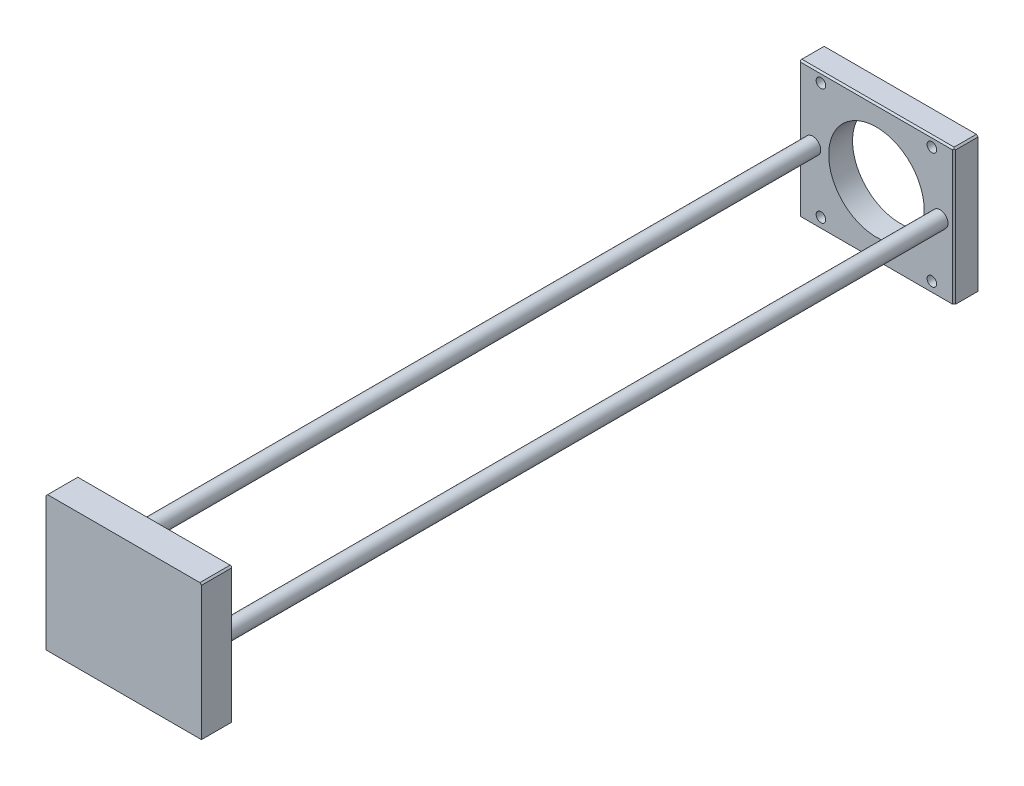
ISO-10303-21;
HEADER;
FILE_DESCRIPTION(('STEP AP214'),'2;1');
FILE_NAME('part.step','',(''),(''),'','','');
FILE_SCHEMA(('AUTOMOTIVE_DESIGN { 1 0 10303 214 1 1 1 1 }'));
ENDSEC;
DATA;
#1=APPLICATION_CONTEXT('core data for automotive mechanical design processes');
#2=APPLICATION_PROTOCOL_DEFINITION('international standard','automotive_design',2000,#1);
#3=PRODUCT_CONTEXT('',#1,'mechanical');
#4=PRODUCT('Part','Part','',(#3));
#5=PRODUCT_RELATED_PRODUCT_CATEGORY('part','',(#4));
#6=PRODUCT_DEFINITION_FORMATION('','',#4);
#7=PRODUCT_DEFINITION_CONTEXT('part definition',#1,'design');
#8=PRODUCT_DEFINITION('design','',#6,#7);
#9=PRODUCT_DEFINITION_SHAPE('','',#8);
#10=(LENGTH_UNIT() NAMED_UNIT(*) SI_UNIT(.MILLI.,.METRE.));
#11=(NAMED_UNIT(*) PLANE_ANGLE_UNIT() SI_UNIT($,.RADIAN.));
#12=(NAMED_UNIT(*) SI_UNIT($,.STERADIAN.) SOLID_ANGLE_UNIT());
#13=UNCERTAINTY_MEASURE_WITH_UNIT(LENGTH_MEASURE(1.E-05),#10,'distance_accuracy_value','');
#14=(GEOMETRIC_REPRESENTATION_CONTEXT(3) GLOBAL_UNCERTAINTY_ASSIGNED_CONTEXT((#13)) GLOBAL_UNIT_ASSIGNED_CONTEXT((#10,
#11,#12)) REPRESENTATION_CONTEXT('',''));
#15=CARTESIAN_POINT('',(0.,0.,0.));
#16=DIRECTION('',(0.,0.,1.));
#17=DIRECTION('',(1.,0.,0.));
#18=AXIS2_PLACEMENT_3D('',#15,#16,#17);
#19=CARTESIAN_POINT('',(0.,0.,15.));
#20=DIRECTION('',(0.,0.,1.));
#21=DIRECTION('',(1.,0.,0.));
#22=AXIS2_PLACEMENT_3D('',#19,#20,#21);
#23=PLANE('',#22);
#24=CARTESIAN_POINT('',(40.,0.,15.));
#25=DIRECTION('',(0.,0.,1.));
#26=DIRECTION('',(-1.,0.,0.));
#27=AXIS2_PLACEMENT_3D('',#24,#25,#26);
#28=CIRCLE('',#27,5.);
#29=CARTESIAN_POINT('',(35.,0.,15.));
#30=VERTEX_POINT('',#29);
#31=EDGE_CURVE('E217',#30,#30,#28,.T.);
#32=ORIENTED_EDGE('',*,*,#31,.F.);
#33=EDGE_LOOP('',(#32));
#34=FACE_BOUND('',#33,.T.);
#35=CARTESIAN_POINT('',(-40.,0.,15.));
#36=DIRECTION('',(0.,0.,1.));
#37=DIRECTION('',(1.,0.,0.));
#38=AXIS2_PLACEMENT_3D('',#35,#36,#37);
#39=CIRCLE('',#38,5.);
#40=CARTESIAN_POINT('',(-45.,0.,15.));
#41=VERTEX_POINT('',#40);
#42=EDGE_CURVE('E221',#41,#41,#39,.T.);
#43=ORIENTED_EDGE('',*,*,#42,.F.);
#44=EDGE_LOOP('',(#43));
#45=FACE_BOUND('',#44,.T.);
#46=CARTESIAN_POINT('',(34.85,-36.5,15.));
#47=DIRECTION('',(0.,0.,1.));
#48=DIRECTION('',(1.,0.,0.));
#49=AXIS2_PLACEMENT_3D('',#46,#47,#48);
#50=CIRCLE('',#49,3.);
#51=CARTESIAN_POINT('',(37.85,-36.5,15.));
#52=VERTEX_POINT('',#51);
#53=EDGE_CURVE('E241',#52,#52,#50,.T.);
#54=ORIENTED_EDGE('',*,*,#53,.F.);
#55=EDGE_LOOP('',(#54));
#56=FACE_BOUND('',#55,.T.);
#57=CARTESIAN_POINT('',(0.,0.,15.));
#58=DIRECTION('',(0.,0.,1.));
#59=DIRECTION('',(1.,0.,0.));
#60=AXIS2_PLACEMENT_3D('',#57,#58,#59);
#61=CIRCLE('',#60,30.);
#62=CARTESIAN_POINT('',(30.,0.,15.));
#63=VERTEX_POINT('',#62);
#64=EDGE_CURVE('E257',#63,#63,#61,.T.);
#65=ORIENTED_EDGE('',*,*,#64,.F.);
#66=EDGE_LOOP('',(#65));
#67=FACE_BOUND('',#66,.T.);
#68=DIRECTION('',(-1.,0.,0.));
#69=VECTOR('',#68,1.);
#70=CARTESIAN_POINT('',(-48.85,41.5,15.));
#71=LINE('',#70,#69);
#72=CARTESIAN_POINT('',(47.8500000000001,41.5000000000001,15.));
#73=VERTEX_POINT('',#72);
#74=CARTESIAN_POINT('',(-47.85,41.5,15.));
#75=VERTEX_POINT('',#74);
#76=EDGE_CURVE('E301',#73,#75,#71,.T.);
#77=ORIENTED_EDGE('',*,*,#76,.T.);
#78=DIRECTION('',(0.,-1.,0.));
#79=VECTOR('',#78,1.);
#80=CARTESIAN_POINT('',(-47.85,-42.5,15.));
#81=LINE('',#80,#79);
#82=CARTESIAN_POINT('',(-47.85,-42.5,15.));
#83=VERTEX_POINT('',#82);
#84=EDGE_CURVE('E304',#75,#83,#81,.T.);
#85=ORIENTED_EDGE('',*,*,#84,.T.);
#86=DIRECTION('',(1.,0.,0.));
#87=VECTOR('',#86,1.);
#88=CARTESIAN_POINT('',(48.85,-42.5,15.));
#89=LINE('',#88,#87);
#90=CARTESIAN_POINT('',(47.8500000000001,-42.5,15.));
#91=VERTEX_POINT('',#90);
#92=EDGE_CURVE('E273',#83,#91,#89,.T.);
#93=ORIENTED_EDGE('',*,*,#92,.T.);
#94=DIRECTION('',(0.,1.,0.));
#95=VECTOR('',#94,1.);
#96=CARTESIAN_POINT('',(47.8500000000001,42.5,15.));
#97=LINE('',#96,#95);
#98=EDGE_CURVE('E298',#91,#73,#97,.T.);
#99=ORIENTED_EDGE('',*,*,#98,.T.);
#100=EDGE_LOOP('',(#77,#85,#93,#99));
#101=FACE_BOUND('',#100,.T.);
#102=CARTESIAN_POINT('',(-34.85,36.5,15.));
#103=DIRECTION('',(0.,0.,1.));
#104=DIRECTION('',(1.,0.,0.));
#105=AXIS2_PLACEMENT_3D('',#102,#103,#104);
#106=CIRCLE('',#105,3.);
#107=CARTESIAN_POINT('',(-31.85,36.5,15.));
#108=VERTEX_POINT('',#107);
#109=EDGE_CURVE('E265',#108,#108,#106,.T.);
#110=ORIENTED_EDGE('',*,*,#109,.F.);
#111=EDGE_LOOP('',(#110));
#112=FACE_BOUND('',#111,.T.);
#113=CARTESIAN_POINT('',(34.8500000000001,36.5,15.));
#114=DIRECTION('',(0.,0.,1.));
#115=DIRECTION('',(-1.,0.,0.));
#116=AXIS2_PLACEMENT_3D('',#113,#114,#115);
#117=CIRCLE('',#116,3.);
#118=CARTESIAN_POINT('',(31.8500000000001,36.5,15.));
#119=VERTEX_POINT('',#118);
#120=EDGE_CURVE('E249',#119,#119,#117,.T.);
#121=ORIENTED_EDGE('',*,*,#120,.F.);
#122=EDGE_LOOP('',(#121));
#123=FACE_BOUND('',#122,.T.);
#124=CARTESIAN_POINT('',(-34.85,-36.5,15.));
#125=DIRECTION('',(0.,0.,1.));
#126=DIRECTION('',(-1.,0.,0.));
#127=AXIS2_PLACEMENT_3D('',#124,#125,#126);
#128=CIRCLE('',#127,3.);
#129=CARTESIAN_POINT('',(-37.85,-36.5,15.));
#130=VERTEX_POINT('',#129);
#131=EDGE_CURVE('E233',#130,#130,#128,.T.);
#132=ORIENTED_EDGE('',*,*,#131,.F.);
#133=EDGE_LOOP('',(#132));
#134=FACE_BOUND('',#133,.T.);
#135=ADVANCED_FACE('F47',(#34,#45,#56,#67,#101,#112,#123,#134),#23,.T.);
#136=CARTESIAN_POINT('',(0.,0.,0.));
#137=DIRECTION('',(0.,0.,1.));
#138=DIRECTION('',(1.,0.,0.));
#139=AXIS2_PLACEMENT_3D('',#136,#137,#138);
#140=PLANE('',#139);
#141=DIRECTION('',(0.,-1.,0.));
#142=VECTOR('',#141,1.);
#143=CARTESIAN_POINT('',(-48.85,-42.5,0.));
#144=LINE('',#143,#142);
#145=CARTESIAN_POINT('',(-48.85,41.5,0.));
#146=VERTEX_POINT('',#145);
#147=CARTESIAN_POINT('',(-48.85,-42.5,0.));
#148=VERTEX_POINT('',#147);
#149=EDGE_CURVE('E269',#146,#148,#144,.T.);
#150=ORIENTED_EDGE('',*,*,#149,.F.);
#151=DIRECTION('',(-0.707106781186548,-0.707106781186548,0.));
#152=VECTOR('',#151,1.);
#153=CARTESIAN_POINT('',(-48.85,41.5,0.));
#154=LINE('',#153,#152);
#155=CARTESIAN_POINT('',(-47.85,42.5,0.));
#156=VERTEX_POINT('',#155);
#157=EDGE_CURVE('E371',#146,#156,#154,.F.);
#158=ORIENTED_EDGE('',*,*,#157,.T.);
#159=DIRECTION('',(-1.,0.,0.));
#160=VECTOR('',#159,1.);
#161=CARTESIAN_POINT('',(48.85,42.5,0.));
#162=LINE('',#161,#160);
#163=CARTESIAN_POINT('',(47.8500000000001,42.5,0.));
#164=VERTEX_POINT('',#163);
#165=EDGE_CURVE('E278',#164,#156,#162,.T.);
#166=ORIENTED_EDGE('',*,*,#165,.F.);
#167=DIRECTION('',(-0.707106781186548,0.707106781186548,0.));
#168=VECTOR('',#167,1.);
#169=CARTESIAN_POINT('',(47.8500000000001,42.5,0.));
#170=LINE('',#169,#168);
#171=CARTESIAN_POINT('',(48.85,41.5000000000001,0.));
#172=VERTEX_POINT('',#171);
#173=EDGE_CURVE('E368',#164,#172,#170,.F.);
#174=ORIENTED_EDGE('',*,*,#173,.T.);
#175=DIRECTION('',(0.,1.,0.));
#176=VECTOR('',#175,1.);
#177=CARTESIAN_POINT('',(48.85,-42.5,0.));
#178=LINE('',#177,#176);
#179=CARTESIAN_POINT('',(48.85,-42.5,0.));
#180=VERTEX_POINT('',#179);
#181=EDGE_CURVE('E285',#180,#172,#178,.T.);
#182=ORIENTED_EDGE('',*,*,#181,.F.);
#183=DIRECTION('',(1.,0.,0.));
#184=VECTOR('',#183,1.);
#185=CARTESIAN_POINT('',(48.85,-42.5,0.));
#186=LINE('',#185,#184);
#187=EDGE_CURVE('E281',#148,#180,#186,.T.);
#188=ORIENTED_EDGE('',*,*,#187,.F.);
#189=EDGE_LOOP('',(#150,#158,#166,#174,#182,#188));
#190=FACE_BOUND('',#189,.T.);
#191=CARTESIAN_POINT('',(-34.85,36.5,0.));
#192=DIRECTION('',(0.,0.,1.));
#193=DIRECTION('',(1.,0.,0.));
#194=AXIS2_PLACEMENT_3D('',#191,#192,#193);
#195=CIRCLE('',#194,3.);
#196=CARTESIAN_POINT('',(-31.85,36.5,0.));
#197=VERTEX_POINT('',#196);
#198=EDGE_CURVE('E261',#197,#197,#195,.T.);
#199=ORIENTED_EDGE('',*,*,#198,.T.);
#200=EDGE_LOOP('',(#199));
#201=FACE_BOUND('',#200,.T.);
#202=CARTESIAN_POINT('',(0.,0.,0.));
#203=DIRECTION('',(0.,0.,1.));
#204=DIRECTION('',(1.,0.,0.));
#205=AXIS2_PLACEMENT_3D('',#202,#203,#204);
#206=CIRCLE('',#205,30.);
#207=CARTESIAN_POINT('',(30.,0.,0.));
#208=VERTEX_POINT('',#207);
#209=EDGE_CURVE('E253',#208,#208,#206,.T.);
#210=ORIENTED_EDGE('',*,*,#209,.T.);
#211=EDGE_LOOP('',(#210));
#212=FACE_BOUND('',#211,.T.);
#213=CARTESIAN_POINT('',(34.8500000000001,36.5,0.));
#214=DIRECTION('',(0.,0.,1.));
#215=DIRECTION('',(-1.,0.,0.));
#216=AXIS2_PLACEMENT_3D('',#213,#214,#215);
#217=CIRCLE('',#216,3.);
#218=CARTESIAN_POINT('',(31.8500000000001,36.5,0.));
#219=VERTEX_POINT('',#218);
#220=EDGE_CURVE('E245',#219,#219,#217,.T.);
#221=ORIENTED_EDGE('',*,*,#220,.T.);
#222=EDGE_LOOP('',(#221));
#223=FACE_BOUND('',#222,.T.);
#224=CARTESIAN_POINT('',(34.85,-36.5,0.));
#225=DIRECTION('',(0.,0.,1.));
#226=DIRECTION('',(1.,0.,0.));
#227=AXIS2_PLACEMENT_3D('',#224,#225,#226);
#228=CIRCLE('',#227,3.);
#229=CARTESIAN_POINT('',(37.85,-36.5,0.));
#230=VERTEX_POINT('',#229);
#231=EDGE_CURVE('E237',#230,#230,#228,.T.);
#232=ORIENTED_EDGE('',*,*,#231,.T.);
#233=EDGE_LOOP('',(#232));
#234=FACE_BOUND('',#233,.T.);
#235=CARTESIAN_POINT('',(-34.85,-36.5,0.));
#236=DIRECTION('',(0.,0.,1.));
#237=DIRECTION('',(-1.,0.,0.));
#238=AXIS2_PLACEMENT_3D('',#235,#236,#237);
#239=CIRCLE('',#238,3.);
#240=CARTESIAN_POINT('',(-37.85,-36.5,0.));
#241=VERTEX_POINT('',#240);
#242=EDGE_CURVE('E229',#241,#241,#239,.T.);
#243=ORIENTED_EDGE('',*,*,#242,.T.);
#244=EDGE_LOOP('',(#243));
#245=FACE_BOUND('',#244,.T.);
#246=ADVANCED_FACE('F454',(#190,#201,#212,#223,#234,#245),#140,.F.);
#247=CARTESIAN_POINT('',(-48.85,-42.5,15.));
#248=DIRECTION('',(1.,0.,0.));
#249=DIRECTION('',(0.,0.,-1.));
#250=AXIS2_PLACEMENT_3D('',#247,#248,#249);
#251=PLANE('',#250);
#252=DIRECTION('',(0.,1.,0.));
#253=VECTOR('',#252,1.);
#254=CARTESIAN_POINT('',(-48.85,42.5,14.0000000000001));
#255=LINE('',#254,#253);
#256=CARTESIAN_POINT('',(-48.85,-42.5,14.0000000000001));
#257=VERTEX_POINT('',#256);
#258=CARTESIAN_POINT('',(-48.85,41.5,14.0000000000001));
#259=VERTEX_POINT('',#258);
#260=EDGE_CURVE('E314',#257,#259,#255,.T.);
#261=ORIENTED_EDGE('',*,*,#260,.T.);
#262=DIRECTION('',(0.,0.,-1.));
#263=VECTOR('',#262,1.);
#264=CARTESIAN_POINT('',(-48.85,41.5,15.));
#265=LINE('',#264,#263);
#266=EDGE_CURVE('E351',#259,#146,#265,.T.);
#267=ORIENTED_EDGE('',*,*,#266,.T.);
#268=ORIENTED_EDGE('',*,*,#149,.T.);
#269=DIRECTION('',(0.,0.,-1.));
#270=VECTOR('',#269,1.);
#271=CARTESIAN_POINT('',(-48.85,-42.5,15.));
#272=LINE('',#271,#270);
#273=EDGE_CURVE('E294',#257,#148,#272,.T.);
#274=ORIENTED_EDGE('',*,*,#273,.F.);
#275=EDGE_LOOP('',(#261,#267,#268,#274));
#276=FACE_BOUND('',#275,.T.);
#277=ADVANCED_FACE('F460',(#276),#251,.F.);
#278=CARTESIAN_POINT('',(48.85,-42.5,15.));
#279=DIRECTION('',(0.,1.,0.));
#280=DIRECTION('',(-1.,0.,0.));
#281=AXIS2_PLACEMENT_3D('',#278,#279,#280);
#282=PLANE('',#281);
#283=ORIENTED_EDGE('',*,*,#92,.F.);
#284=DIRECTION('',(-0.707106781186547,0.,-0.707106781186547));
#285=VECTOR('',#284,1.);
#286=CARTESIAN_POINT('',(-47.85,-42.5,15.));
#287=LINE('',#286,#285);
#288=EDGE_CURVE('E311',#83,#257,#287,.T.);
#289=ORIENTED_EDGE('',*,*,#288,.T.);
#290=ORIENTED_EDGE('',*,*,#273,.T.);
#291=ORIENTED_EDGE('',*,*,#187,.T.);
#292=DIRECTION('',(0.,0.,-1.));
#293=VECTOR('',#292,1.);
#294=CARTESIAN_POINT('',(48.85,-42.5,15.));
#295=LINE('',#294,#293);
#296=CARTESIAN_POINT('',(48.85,-42.5,14.0000000000001));
#297=VERTEX_POINT('',#296);
#298=EDGE_CURVE('E277',#297,#180,#295,.T.);
#299=ORIENTED_EDGE('',*,*,#298,.F.);
#300=DIRECTION('',(-0.707106781186547,0.,0.707106781186547));
#301=VECTOR('',#300,1.);
#302=CARTESIAN_POINT('',(47.8500000000001,-42.5,15.));
#303=LINE('',#302,#301);
#304=EDGE_CURVE('E308',#297,#91,#303,.T.);
#305=ORIENTED_EDGE('',*,*,#304,.T.);
#306=EDGE_LOOP('',(#283,#289,#290,#291,#299,#305));
#307=FACE_BOUND('',#306,.T.);
#308=ADVANCED_FACE('F476',(#307),#282,.F.);
#309=CARTESIAN_POINT('',(48.85,-42.5,15.));
#310=DIRECTION('',(-1.,0.,0.));
#311=DIRECTION('',(0.,0.,1.));
#312=AXIS2_PLACEMENT_3D('',#309,#310,#311);
#313=PLANE('',#312);
#314=ORIENTED_EDGE('',*,*,#181,.T.);
#315=DIRECTION('',(0.,0.,1.));
#316=VECTOR('',#315,1.);
#317=CARTESIAN_POINT('',(48.85,41.5000000000001,15.));
#318=LINE('',#317,#316);
#319=CARTESIAN_POINT('',(48.85,41.5000000000001,14.0000000000001));
#320=VERTEX_POINT('',#319);
#321=EDGE_CURVE('E390',#172,#320,#318,.T.);
#322=ORIENTED_EDGE('',*,*,#321,.T.);
#323=DIRECTION('',(0.,-1.,0.));
#324=VECTOR('',#323,1.);
#325=CARTESIAN_POINT('',(48.85,-42.5,14.0000000000001));
#326=LINE('',#325,#324);
#327=EDGE_CURVE('E322',#320,#297,#326,.T.);
#328=ORIENTED_EDGE('',*,*,#327,.T.);
#329=ORIENTED_EDGE('',*,*,#298,.T.);
#330=EDGE_LOOP('',(#314,#322,#328,#329));
#331=FACE_BOUND('',#330,.T.);
#332=ADVANCED_FACE('F472',(#331),#313,.F.);
#333=CARTESIAN_POINT('',(48.85,42.5,15.));
#334=DIRECTION('',(0.,-1.,0.));
#335=DIRECTION('',(1.,0.,0.));
#336=AXIS2_PLACEMENT_3D('',#333,#334,#335);
#337=PLANE('',#336);
#338=ORIENTED_EDGE('',*,*,#165,.T.);
#339=DIRECTION('',(0.,0.,1.));
#340=VECTOR('',#339,1.);
#341=CARTESIAN_POINT('',(-47.85,42.5,15.));
#342=LINE('',#341,#340);
#343=CARTESIAN_POINT('',(-47.85,42.5,14.0000000000001));
#344=VERTEX_POINT('',#343);
#345=EDGE_CURVE('E378',#156,#344,#342,.T.);
#346=ORIENTED_EDGE('',*,*,#345,.T.);
#347=DIRECTION('',(1.,0.,0.));
#348=VECTOR('',#347,1.);
#349=CARTESIAN_POINT('',(48.85,42.5,14.0000000000001));
#350=LINE('',#349,#348);
#351=CARTESIAN_POINT('',(47.8500000000001,42.5,14.0000000000001));
#352=VERTEX_POINT('',#351);
#353=EDGE_CURVE('E318',#344,#352,#350,.T.);
#354=ORIENTED_EDGE('',*,*,#353,.T.);
#355=DIRECTION('',(0.,0.,-1.));
#356=VECTOR('',#355,1.);
#357=CARTESIAN_POINT('',(47.8500000000001,42.5,15.));
#358=LINE('',#357,#356);
#359=EDGE_CURVE('E374',#352,#164,#358,.T.);
#360=ORIENTED_EDGE('',*,*,#359,.T.);
#361=EDGE_LOOP('',(#338,#346,#354,#360));
#362=FACE_BOUND('',#361,.T.);
#363=ADVANCED_FACE('F469',(#362),#337,.F.);
#364=CARTESIAN_POINT('',(-34.85,36.5,15.));
#365=DIRECTION('',(0.,0.,-1.));
#366=DIRECTION('',(-1.,0.,0.));
#367=AXIS2_PLACEMENT_3D('',#364,#365,#366);
#368=CYLINDRICAL_SURFACE('',#367,3.);
#369=ORIENTED_EDGE('',*,*,#109,.T.);
#370=EDGE_LOOP('',(#369));
#371=FACE_BOUND('',#370,.T.);
#372=ORIENTED_EDGE('',*,*,#198,.F.);
#373=EDGE_LOOP('',(#372));
#374=FACE_BOUND('',#373,.T.);
#375=ADVANCED_FACE('F466',(#371,#374),#368,.F.);
#376=CARTESIAN_POINT('',(0.,0.,15.));
#377=DIRECTION('',(0.,0.,-1.));
#378=DIRECTION('',(-1.,0.,0.));
#379=AXIS2_PLACEMENT_3D('',#376,#377,#378);
#380=CYLINDRICAL_SURFACE('',#379,30.);
#381=ORIENTED_EDGE('',*,*,#64,.T.);
#382=EDGE_LOOP('',(#381));
#383=FACE_BOUND('',#382,.T.);
#384=ORIENTED_EDGE('',*,*,#209,.F.);
#385=EDGE_LOOP('',(#384));
#386=FACE_BOUND('',#385,.T.);
#387=ADVANCED_FACE('F590',(#383,#386),#380,.F.);
#388=CARTESIAN_POINT('',(34.8500000000001,36.5,15.));
#389=DIRECTION('',(0.,0.,-1.));
#390=DIRECTION('',(-1.,0.,0.));
#391=AXIS2_PLACEMENT_3D('',#388,#389,#390);
#392=CYLINDRICAL_SURFACE('',#391,3.);
#393=ORIENTED_EDGE('',*,*,#120,.T.);
#394=EDGE_LOOP('',(#393));
#395=FACE_BOUND('',#394,.T.);
#396=ORIENTED_EDGE('',*,*,#220,.F.);
#397=EDGE_LOOP('',(#396));
#398=FACE_BOUND('',#397,.T.);
#399=ADVANCED_FACE('F584',(#395,#398),#392,.F.);
#400=CARTESIAN_POINT('',(34.85,-36.5,15.));
#401=DIRECTION('',(0.,0.,-1.));
#402=DIRECTION('',(-1.,0.,0.));
#403=AXIS2_PLACEMENT_3D('',#400,#401,#402);
#404=CYLINDRICAL_SURFACE('',#403,3.);
#405=ORIENTED_EDGE('',*,*,#53,.T.);
#406=EDGE_LOOP('',(#405));
#407=FACE_BOUND('',#406,.T.);
#408=ORIENTED_EDGE('',*,*,#231,.F.);
#409=EDGE_LOOP('',(#408));
#410=FACE_BOUND('',#409,.T.);
#411=ADVANCED_FACE('F574',(#407,#410),#404,.F.);
#412=CARTESIAN_POINT('',(-34.85,-36.5,15.));
#413=DIRECTION('',(0.,0.,-1.));
#414=DIRECTION('',(-1.,0.,0.));
#415=AXIS2_PLACEMENT_3D('',#412,#413,#414);
#416=CYLINDRICAL_SURFACE('',#415,3.);
#417=ORIENTED_EDGE('',*,*,#131,.T.);
#418=EDGE_LOOP('',(#417));
#419=FACE_BOUND('',#418,.T.);
#420=ORIENTED_EDGE('',*,*,#242,.F.);
#421=EDGE_LOOP('',(#420));
#422=FACE_BOUND('',#421,.T.);
#423=ADVANCED_FACE('F571',(#419,#422),#416,.F.);
#424=CARTESIAN_POINT('',(-40.,0.,468.));
#425=DIRECTION('',(0.,0.,-1.));
#426=DIRECTION('',(-1.,0.,0.));
#427=AXIS2_PLACEMENT_3D('',#424,#425,#426);
#428=CYLINDRICAL_SURFACE('',#427,5.);
#429=CARTESIAN_POINT('',(-40.,0.,468.));
#430=DIRECTION('',(0.,0.,1.));
#431=DIRECTION('',(1.,0.,0.));
#432=AXIS2_PLACEMENT_3D('',#429,#430,#431);
#433=CIRCLE('',#432,5.);
#434=CARTESIAN_POINT('',(-45.,0.,468.));
#435=VERTEX_POINT('',#434);
#436=EDGE_CURVE('E225',#435,#435,#433,.T.);
#437=CARTESIAN_POINT('',(-45.,0.,468.));
#438=CARTESIAN_POINT('',(-45.,0.,463.28125));
#439=CARTESIAN_POINT('',(-45.,0.,458.5625));
#440=CARTESIAN_POINT('',(-45.,0.,449.125));
#441=CARTESIAN_POINT('',(-45.,0.,444.40625));
#442=CARTESIAN_POINT('',(-45.,0.,434.96875));
#443=CARTESIAN_POINT('',(-45.,0.,430.25));
#444=CARTESIAN_POINT('',(-45.,0.,420.8125));
#445=CARTESIAN_POINT('',(-45.,0.,416.09375));
#446=CARTESIAN_POINT('',(-45.,0.,406.65625));
#447=CARTESIAN_POINT('',(-45.,0.,401.9375));
#448=CARTESIAN_POINT('',(-45.,0.,392.5));
#449=CARTESIAN_POINT('',(-45.,0.,387.78125));
#450=CARTESIAN_POINT('',(-45.,0.,378.34375));
#451=CARTESIAN_POINT('',(-45.,0.,373.625));
#452=CARTESIAN_POINT('',(-45.,0.,364.1875));
#453=CARTESIAN_POINT('',(-45.,0.,359.46875));
#454=CARTESIAN_POINT('',(-45.,0.,350.03125));
#455=CARTESIAN_POINT('',(-45.,0.,345.3125));
#456=CARTESIAN_POINT('',(-45.,0.,335.875));
#457=CARTESIAN_POINT('',(-45.,0.,331.15625));
#458=CARTESIAN_POINT('',(-45.,0.,321.71875));
#459=CARTESIAN_POINT('',(-45.,0.,317.));
#460=CARTESIAN_POINT('',(-45.,0.,307.5625));
#461=CARTESIAN_POINT('',(-45.,0.,302.84375));
#462=CARTESIAN_POINT('',(-45.,0.,293.40625));
#463=CARTESIAN_POINT('',(-45.,0.,288.6875));
#464=CARTESIAN_POINT('',(-45.,0.,279.25));
#465=CARTESIAN_POINT('',(-45.,0.,274.53125));
#466=CARTESIAN_POINT('',(-45.,0.,265.09375));
#467=CARTESIAN_POINT('',(-45.,0.,260.375));
#468=CARTESIAN_POINT('',(-45.,0.,250.9375));
#469=CARTESIAN_POINT('',(-45.,0.,246.21875));
#470=CARTESIAN_POINT('',(-45.,0.,236.78125));
#471=CARTESIAN_POINT('',(-45.,0.,232.0625));
#472=CARTESIAN_POINT('',(-45.,0.,222.625));
#473=CARTESIAN_POINT('',(-45.,0.,217.90625));
#474=CARTESIAN_POINT('',(-45.,0.,208.46875));
#475=CARTESIAN_POINT('',(-45.,0.,203.75));
#476=CARTESIAN_POINT('',(-45.,0.,194.3125));
#477=CARTESIAN_POINT('',(-45.,0.,189.59375));
#478=CARTESIAN_POINT('',(-45.,0.,180.15625));
#479=CARTESIAN_POINT('',(-45.,0.,175.4375));
#480=CARTESIAN_POINT('',(-45.,0.,166.));
#481=CARTESIAN_POINT('',(-45.,0.,161.28125));
#482=CARTESIAN_POINT('',(-45.,0.,151.84375));
#483=CARTESIAN_POINT('',(-45.,0.,147.125));
#484=CARTESIAN_POINT('',(-45.,0.,137.6875));
#485=CARTESIAN_POINT('',(-45.,0.,132.96875));
#486=CARTESIAN_POINT('',(-45.,0.,123.53125));
#487=CARTESIAN_POINT('',(-45.,0.,118.8125));
#488=CARTESIAN_POINT('',(-45.,0.,109.375));
#489=CARTESIAN_POINT('',(-45.,0.,104.65625));
#490=CARTESIAN_POINT('',(-45.,0.,95.21875));
#491=CARTESIAN_POINT('',(-45.,0.,90.5));
#492=CARTESIAN_POINT('',(-45.,0.,81.0625));
#493=CARTESIAN_POINT('',(-45.,0.,76.34375));
#494=CARTESIAN_POINT('',(-45.,0.,66.90625));
#495=CARTESIAN_POINT('',(-45.,0.,62.1875));
#496=CARTESIAN_POINT('',(-45.,0.,52.75));
#497=CARTESIAN_POINT('',(-45.,0.,48.03125));
#498=CARTESIAN_POINT('',(-45.,0.,38.59375));
#499=CARTESIAN_POINT('',(-45.,0.,33.875));
#500=CARTESIAN_POINT('',(-45.,0.,24.4375));
#501=CARTESIAN_POINT('',(-45.,0.,19.71875));
#502=CARTESIAN_POINT('',(-45.,0.,15.));
#503=B_SPLINE_CURVE_WITH_KNOTS('',3,(#437,#438,#439,#440,#441,#442,#443,#444,#445,#446,#447,
#448,#449,#450,#451,#452,#453,#454,#455,#456,#457,#458,#459,#460,#461,#462,#463,#464,#465,#466,
#467,#468,#469,#470,#471,#472,#473,#474,#475,#476,#477,#478,#479,#480,#481,#482,#483,#484,#485,
#486,#487,#488,#489,#490,#491,#492,#493,#494,#495,#496,#497,#498,#499,#500,#501,#502),
.UNSPECIFIED.,.F.,.F.,(4,2,2,2,2,2,2,2,2,2,2,2,2,2,2,2,2,2,2,2,2,2,2,2,2,2,2,2,2,2,2,2,4),(0.,
14.15625,28.3125,42.46875,56.625,70.78125,84.9375000000001,99.09375,113.25,127.40625,141.5625,
155.71875,169.875,184.03125,198.1875,212.34375,226.5,240.65625,254.8125,268.96875,283.125,
297.28125,311.4375,325.59375,339.75,353.90625,368.0625,382.21875,396.375,410.53125,424.6875,
438.84375,453.),.UNSPECIFIED.);
#504=EDGE_CURVE('BSEAM573',#435,#41,#503,.T.);
#505=ORIENTED_EDGE('',*,*,#436,.F.);
#506=ORIENTED_EDGE('',*,*,#42,.T.);
#507=ORIENTED_EDGE('',*,*,#504,.T.);
#508=ORIENTED_EDGE('',*,*,#504,.F.);
#509=EDGE_LOOP('',(#505,#507,#506,#508));
#510=FACE_BOUND('',#509,.T.);
#511=ADVANCED_FACE('F573',(#510),#428,.T.);
#512=CARTESIAN_POINT('',(40.,0.,468.));
#513=DIRECTION('',(0.,0.,-1.));
#514=DIRECTION('',(-1.,0.,0.));
#515=AXIS2_PLACEMENT_3D('',#512,#513,#514);
#516=CYLINDRICAL_SURFACE('',#515,5.);
#517=CARTESIAN_POINT('',(40.,0.,468.));
#518=DIRECTION('',(0.,0.,1.));
#519=DIRECTION('',(-1.,0.,0.));
#520=AXIS2_PLACEMENT_3D('',#517,#518,#519);
#521=CIRCLE('',#520,5.);
#522=CARTESIAN_POINT('',(35.,0.,468.));
#523=VERTEX_POINT('',#522);
#524=EDGE_CURVE('E215',#523,#523,#521,.T.);
#525=CARTESIAN_POINT('',(35.,0.,468.));
#526=CARTESIAN_POINT('',(35.,0.,463.28125));
#527=CARTESIAN_POINT('',(35.,0.,458.5625));
#528=CARTESIAN_POINT('',(35.,0.,449.125));
#529=CARTESIAN_POINT('',(35.,0.,444.40625));
#530=CARTESIAN_POINT('',(35.,0.,434.96875));
#531=CARTESIAN_POINT('',(35.,0.,430.25));
#532=CARTESIAN_POINT('',(35.,0.,420.8125));
#533=CARTESIAN_POINT('',(35.,0.,416.09375));
#534=CARTESIAN_POINT('',(35.,0.,406.65625));
#535=CARTESIAN_POINT('',(35.,0.,401.9375));
#536=CARTESIAN_POINT('',(35.,0.,392.5));
#537=CARTESIAN_POINT('',(35.,0.,387.78125));
#538=CARTESIAN_POINT('',(35.,0.,378.34375));
#539=CARTESIAN_POINT('',(35.,0.,373.625));
#540=CARTESIAN_POINT('',(35.,0.,364.1875));
#541=CARTESIAN_POINT('',(35.,0.,359.46875));
#542=CARTESIAN_POINT('',(35.,0.,350.03125));
#543=CARTESIAN_POINT('',(35.,0.,345.3125));
#544=CARTESIAN_POINT('',(35.,0.,335.875));
#545=CARTESIAN_POINT('',(35.,0.,331.15625));
#546=CARTESIAN_POINT('',(35.,0.,321.71875));
#547=CARTESIAN_POINT('',(35.,0.,317.));
#548=CARTESIAN_POINT('',(35.,0.,307.5625));
#549=CARTESIAN_POINT('',(35.,0.,302.84375));
#550=CARTESIAN_POINT('',(35.,0.,293.40625));
#551=CARTESIAN_POINT('',(35.,0.,288.6875));
#552=CARTESIAN_POINT('',(35.,0.,279.25));
#553=CARTESIAN_POINT('',(35.,0.,274.53125));
#554=CARTESIAN_POINT('',(35.,0.,265.09375));
#555=CARTESIAN_POINT('',(35.,0.,260.375));
#556=CARTESIAN_POINT('',(35.,0.,250.9375));
#557=CARTESIAN_POINT('',(35.,0.,246.21875));
#558=CARTESIAN_POINT('',(35.,0.,236.78125));
#559=CARTESIAN_POINT('',(35.,0.,232.0625));
#560=CARTESIAN_POINT('',(35.,0.,222.625));
#561=CARTESIAN_POINT('',(35.,0.,217.90625));
#562=CARTESIAN_POINT('',(35.,0.,208.46875));
#563=CARTESIAN_POINT('',(35.,0.,203.75));
#564=CARTESIAN_POINT('',(35.,0.,194.3125));
#565=CARTESIAN_POINT('',(35.,0.,189.59375));
#566=CARTESIAN_POINT('',(35.,0.,180.15625));
#567=CARTESIAN_POINT('',(35.,0.,175.4375));
#568=CARTESIAN_POINT('',(35.,0.,166.));
#569=CARTESIAN_POINT('',(35.,0.,161.28125));
#570=CARTESIAN_POINT('',(35.,0.,151.84375));
#571=CARTESIAN_POINT('',(35.,0.,147.125));
#572=CARTESIAN_POINT('',(35.,0.,137.6875));
#573=CARTESIAN_POINT('',(35.,0.,132.96875));
#574=CARTESIAN_POINT('',(35.,0.,123.53125));
#575=CARTESIAN_POINT('',(35.,0.,118.8125));
#576=CARTESIAN_POINT('',(35.,0.,109.375));
#577=CARTESIAN_POINT('',(35.,0.,104.65625));
#578=CARTESIAN_POINT('',(35.,0.,95.21875));
#579=CARTESIAN_POINT('',(35.,0.,90.5));
#580=CARTESIAN_POINT('',(35.,0.,81.0625));
#581=CARTESIAN_POINT('',(35.,0.,76.34375));
#582=CARTESIAN_POINT('',(35.,0.,66.90625));
#583=CARTESIAN_POINT('',(35.,0.,62.1875));
#584=CARTESIAN_POINT('',(35.,0.,52.75));
#585=CARTESIAN_POINT('',(35.,0.,48.03125));
#586=CARTESIAN_POINT('',(35.,0.,38.59375));
#587=CARTESIAN_POINT('',(35.,0.,33.875));
#588=CARTESIAN_POINT('',(35.,0.,24.4375));
#589=CARTESIAN_POINT('',(35.,0.,19.71875));
#590=CARTESIAN_POINT('',(35.,0.,15.));
#591=B_SPLINE_CURVE_WITH_KNOTS('',3,(#525,#526,#527,#528,#529,#530,#531,#532,#533,#534,#535,
#536,#537,#538,#539,#540,#541,#542,#543,#544,#545,#546,#547,#548,#549,#550,#551,#552,#553,#554,
#555,#556,#557,#558,#559,#560,#561,#562,#563,#564,#565,#566,#567,#568,#569,#570,#571,#572,#573,
#574,#575,#576,#577,#578,#579,#580,#581,#582,#583,#584,#585,#586,#587,#588,#589,#590),
.UNSPECIFIED.,.F.,.F.,(4,2,2,2,2,2,2,2,2,2,2,2,2,2,2,2,2,2,2,2,2,2,2,2,2,2,2,2,2,2,2,2,4),(0.,
14.15625,28.3125,42.46875,56.625,70.78125,84.9375000000001,99.09375,113.25,127.40625,141.5625,
155.71875,169.875,184.03125,198.1875,212.34375,226.5,240.65625,254.8125,268.96875,283.125,
297.28125,311.4375,325.59375,339.75,353.90625,368.0625,382.21875,396.375,410.53125,424.6875,
438.84375,453.),.UNSPECIFIED.);
#592=EDGE_CURVE('BSEAM581',#523,#30,#591,.T.);
#593=ORIENTED_EDGE('',*,*,#524,.F.);
#594=ORIENTED_EDGE('',*,*,#31,.T.);
#595=ORIENTED_EDGE('',*,*,#592,.T.);
#596=ORIENTED_EDGE('',*,*,#592,.F.);
#597=EDGE_LOOP('',(#593,#595,#594,#596));
#598=FACE_BOUND('',#597,.T.);
#599=ADVANCED_FACE('F581',(#598),#516,.T.);
#600=CARTESIAN_POINT('',(-40.,-42.5,488.));
#601=DIRECTION('',(0.,-1.,0.));
#602=DIRECTION('',(0.,0.,-1.));
#603=AXIS2_PLACEMENT_3D('',#600,#601,#602);
#604=PLANE('',#603);
#605=DIRECTION('',(0.,0.,-1.));
#606=VECTOR('',#605,1.);
#607=CARTESIAN_POINT('',(-48.85,-42.5,488.));
#608=LINE('',#607,#606);
#609=CARTESIAN_POINT('',(-48.85,-42.5,488.));
#610=VERTEX_POINT('',#609);
#611=CARTESIAN_POINT('',(-48.85,-42.5,469.));
#612=VERTEX_POINT('',#611);
#613=EDGE_CURVE('E173',#610,#612,#608,.T.);
#614=ORIENTED_EDGE('',*,*,#613,.T.);
#615=DIRECTION('',(-0.707106781186548,0.,0.707106781186548));
#616=VECTOR('',#615,1.);
#617=CARTESIAN_POINT('',(-53.925,-42.5,474.075));
#618=LINE('',#617,#616);
#619=CARTESIAN_POINT('',(-47.85,-42.5,468.));
#620=VERTEX_POINT('',#619);
#621=EDGE_CURVE('E341',#612,#620,#618,.F.);
#622=ORIENTED_EDGE('',*,*,#621,.T.);
#623=DIRECTION('',(-1.,0.,0.));
#624=VECTOR('',#623,1.);
#625=CARTESIAN_POINT('',(-40.,-42.5,468.));
#626=LINE('',#625,#624);
#627=CARTESIAN_POINT('',(47.8500000000001,-42.5,468.));
#628=VERTEX_POINT('',#627);
#629=EDGE_CURVE('E202',#628,#620,#626,.T.);
#630=ORIENTED_EDGE('',*,*,#629,.F.);
#631=DIRECTION('',(-0.707106781186548,0.,-0.707106781186548));
#632=VECTOR('',#631,1.);
#633=CARTESIAN_POINT('',(13.925,-42.5,434.075));
#634=LINE('',#633,#632);
#635=CARTESIAN_POINT('',(48.85,-42.5,469.));
#636=VERTEX_POINT('',#635);
#637=EDGE_CURVE('E338',#628,#636,#634,.F.);
#638=ORIENTED_EDGE('',*,*,#637,.T.);
#639=DIRECTION('',(0.,0.,-1.));
#640=VECTOR('',#639,1.);
#641=CARTESIAN_POINT('',(48.85,-42.5,488.));
#642=LINE('',#641,#640);
#643=CARTESIAN_POINT('',(48.85,-42.5,488.));
#644=VERTEX_POINT('',#643);
#645=EDGE_CURVE('E185',#644,#636,#642,.T.);
#646=ORIENTED_EDGE('',*,*,#645,.F.);
#647=DIRECTION('',(-1.,0.,0.));
#648=VECTOR('',#647,1.);
#649=CARTESIAN_POINT('',(-40.,-42.5,488.));
#650=LINE('',#649,#648);
#651=EDGE_CURVE('E192',#644,#610,#650,.T.);
#652=ORIENTED_EDGE('',*,*,#651,.T.);
#653=EDGE_LOOP('',(#614,#622,#630,#638,#646,#652));
#654=FACE_BOUND('',#653,.T.);
#655=ADVANCED_FACE('F199',(#654),#604,.T.);
#656=CARTESIAN_POINT('',(48.85,0.,488.));
#657=DIRECTION('',(1.,0.,0.));
#658=DIRECTION('',(0.,0.,-1.));
#659=AXIS2_PLACEMENT_3D('',#656,#657,#658);
#660=PLANE('',#659);
#661=DIRECTION('',(0.,1.,0.));
#662=VECTOR('',#661,1.);
#663=CARTESIAN_POINT('',(48.85,0.,469.));
#664=LINE('',#663,#662);
#665=CARTESIAN_POINT('',(48.85,41.5,469.));
#666=VERTEX_POINT('',#665);
#667=EDGE_CURVE('E348',#636,#666,#664,.T.);
#668=ORIENTED_EDGE('',*,*,#667,.T.);
#669=DIRECTION('',(0.,0.,1.));
#670=VECTOR('',#669,1.);
#671=CARTESIAN_POINT('',(48.85,41.5,488.));
#672=LINE('',#671,#670);
#673=CARTESIAN_POINT('',(48.85,41.5,488.));
#674=VERTEX_POINT('',#673);
#675=EDGE_CURVE('E11',#666,#674,#672,.T.);
#676=ORIENTED_EDGE('',*,*,#675,.T.);
#677=DIRECTION('',(0.,-1.,0.));
#678=VECTOR('',#677,1.);
#679=CARTESIAN_POINT('',(48.85,0.,488.));
#680=LINE('',#679,#678);
#681=EDGE_CURVE('E186',#674,#644,#680,.T.);
#682=ORIENTED_EDGE('',*,*,#681,.T.);
#683=ORIENTED_EDGE('',*,*,#645,.T.);
#684=EDGE_LOOP('',(#668,#676,#682,#683));
#685=FACE_BOUND('',#684,.T.);
#686=ADVANCED_FACE('F654',(#685),#660,.T.);
#687=CARTESIAN_POINT('',(-40.,42.5,488.));
#688=DIRECTION('',(0.,1.,0.));
#689=DIRECTION('',(0.,0.,1.));
#690=AXIS2_PLACEMENT_3D('',#687,#688,#689);
#691=PLANE('',#690);
#692=DIRECTION('',(-1.,0.,0.));
#693=VECTOR('',#692,1.);
#694=CARTESIAN_POINT('',(-40.,42.5,469.));
#695=LINE('',#694,#693);
#696=CARTESIAN_POINT('',(47.8500000000001,42.5,469.));
#697=VERTEX_POINT('',#696);
#698=CARTESIAN_POINT('',(-47.85,42.5,469.));
#699=VERTEX_POINT('',#698);
#700=EDGE_CURVE('E344',#697,#699,#695,.T.);
#701=ORIENTED_EDGE('',*,*,#700,.T.);
#702=DIRECTION('',(0.,0.,1.));
#703=VECTOR('',#702,1.);
#704=CARTESIAN_POINT('',(-47.85,42.5,488.));
#705=LINE('',#704,#703);
#706=CARTESIAN_POINT('',(-47.85,42.5,488.));
#707=VERTEX_POINT('',#706);
#708=EDGE_CURVE('E412',#699,#707,#705,.T.);
#709=ORIENTED_EDGE('',*,*,#708,.T.);
#710=DIRECTION('',(1.,0.,0.));
#711=VECTOR('',#710,1.);
#712=CARTESIAN_POINT('',(-40.,42.5,488.));
#713=LINE('',#712,#711);
#714=CARTESIAN_POINT('',(47.8500000000001,42.5,488.));
#715=VERTEX_POINT('',#714);
#716=EDGE_CURVE('E196',#707,#715,#713,.T.);
#717=ORIENTED_EDGE('',*,*,#716,.T.);
#718=DIRECTION('',(0.,0.,-1.));
#719=VECTOR('',#718,1.);
#720=CARTESIAN_POINT('',(47.8500000000001,42.5,488.));
#721=LINE('',#720,#719);
#722=EDGE_CURVE('E408',#715,#697,#721,.T.);
#723=ORIENTED_EDGE('',*,*,#722,.T.);
#724=EDGE_LOOP('',(#701,#709,#717,#723));
#725=FACE_BOUND('',#724,.T.);
#726=ADVANCED_FACE('F424',(#725),#691,.T.);
#727=CARTESIAN_POINT('',(-48.85,0.,488.));
#728=DIRECTION('',(-1.,0.,0.));
#729=DIRECTION('',(0.,0.,1.));
#730=AXIS2_PLACEMENT_3D('',#727,#728,#729);
#731=PLANE('',#730);
#732=DIRECTION('',(0.,1.,0.));
#733=VECTOR('',#732,1.);
#734=CARTESIAN_POINT('',(-48.85,0.,488.));
#735=LINE('',#734,#733);
#736=CARTESIAN_POINT('',(-48.85,41.5,488.));
#737=VERTEX_POINT('',#736);
#738=EDGE_CURVE('E177',#610,#737,#735,.T.);
#739=ORIENTED_EDGE('',*,*,#738,.T.);
#740=DIRECTION('',(0.,0.,-1.));
#741=VECTOR('',#740,1.);
#742=CARTESIAN_POINT('',(-48.85,41.5,488.));
#743=LINE('',#742,#741);
#744=CARTESIAN_POINT('',(-48.85,41.5,469.));
#745=VERTEX_POINT('',#744);
#746=EDGE_CURVE('E396',#737,#745,#743,.T.);
#747=ORIENTED_EDGE('',*,*,#746,.T.);
#748=DIRECTION('',(0.,-1.,0.));
#749=VECTOR('',#748,1.);
#750=CARTESIAN_POINT('',(-48.85,0.,469.));
#751=LINE('',#750,#749);
#752=EDGE_CURVE('E180',#745,#612,#751,.T.);
#753=ORIENTED_EDGE('',*,*,#752,.T.);
#754=ORIENTED_EDGE('',*,*,#613,.F.);
#755=EDGE_LOOP('',(#739,#747,#753,#754));
#756=FACE_BOUND('',#755,.T.);
#757=ADVANCED_FACE('F175',(#756),#731,.T.);
#758=CARTESIAN_POINT('',(0.,0.,488.));
#759=DIRECTION('',(0.,0.,-1.));
#760=DIRECTION('',(-1.,0.,0.));
#761=AXIS2_PLACEMENT_3D('',#758,#759,#760);
#762=PLANE('',#761);
#763=ORIENTED_EDGE('',*,*,#716,.F.);
#764=DIRECTION('',(0.707106781186548,0.707106781186548,0.));
#765=VECTOR('',#764,1.);
#766=CARTESIAN_POINT('',(-48.85,41.5,488.));
#767=LINE('',#766,#765);
#768=EDGE_CURVE('E194',#707,#737,#767,.F.);
#769=ORIENTED_EDGE('',*,*,#768,.T.);
#770=ORIENTED_EDGE('',*,*,#738,.F.);
#771=ORIENTED_EDGE('',*,*,#651,.F.);
#772=ORIENTED_EDGE('',*,*,#681,.F.);
#773=DIRECTION('',(0.707106781186548,-0.707106781186548,0.));
#774=VECTOR('',#773,1.);
#775=CARTESIAN_POINT('',(47.8500000000001,42.5,488.));
#776=LINE('',#775,#774);
#777=EDGE_CURVE('E415',#674,#715,#776,.F.);
#778=ORIENTED_EDGE('',*,*,#777,.T.);
#779=EDGE_LOOP('',(#763,#769,#770,#771,#772,#778));
#780=FACE_BOUND('',#779,.T.);
#781=ADVANCED_FACE('F191',(#780),#762,.F.);
#782=CARTESIAN_POINT('',(0.,0.,468.));
#783=DIRECTION('',(0.,0.,-1.));
#784=DIRECTION('',(-1.,0.,0.));
#785=AXIS2_PLACEMENT_3D('',#782,#783,#784);
#786=PLANE('',#785);
#787=ORIENTED_EDGE('',*,*,#436,.T.);
#788=EDGE_LOOP('',(#787));
#789=FACE_BOUND('',#788,.T.);
#790=ORIENTED_EDGE('',*,*,#524,.T.);
#791=EDGE_LOOP('',(#790));
#792=FACE_BOUND('',#791,.T.);
#793=ORIENTED_EDGE('',*,*,#629,.T.);
#794=DIRECTION('',(0.,1.,0.));
#795=VECTOR('',#794,1.);
#796=CARTESIAN_POINT('',(-47.85,0.,468.));
#797=LINE('',#796,#795);
#798=CARTESIAN_POINT('',(-47.85,41.5,468.));
#799=VERTEX_POINT('',#798);
#800=EDGE_CURVE('E332',#620,#799,#797,.T.);
#801=ORIENTED_EDGE('',*,*,#800,.T.);
#802=DIRECTION('',(1.,0.,0.));
#803=VECTOR('',#802,1.);
#804=CARTESIAN_POINT('',(0.,41.5,468.));
#805=LINE('',#804,#803);
#806=CARTESIAN_POINT('',(47.8500000000001,41.5,468.));
#807=VERTEX_POINT('',#806);
#808=EDGE_CURVE('E328',#799,#807,#805,.T.);
#809=ORIENTED_EDGE('',*,*,#808,.T.);
#810=DIRECTION('',(0.,-1.,0.));
#811=VECTOR('',#810,1.);
#812=CARTESIAN_POINT('',(47.8500000000001,0.,468.));
#813=LINE('',#812,#811);
#814=EDGE_CURVE('E325',#807,#628,#813,.T.);
#815=ORIENTED_EDGE('',*,*,#814,.T.);
#816=EDGE_LOOP('',(#793,#801,#809,#815));
#817=FACE_BOUND('',#816,.T.);
#818=ADVANCED_FACE('F436',(#789,#792,#817),#786,.T.);
#819=CARTESIAN_POINT('',(47.8500000000001,0.,15.));
#820=DIRECTION('',(0.707106781186547,0.,0.707106781186547));
#821=DIRECTION('',(0.,-1.,0.));
#822=AXIS2_PLACEMENT_3D('',#819,#820,#821);
#823=PLANE('',#822);
#824=ORIENTED_EDGE('',*,*,#327,.F.);
#825=DIRECTION('',(0.577350269189626,-0.577350269189626,-0.577350269189626));
#826=VECTOR('',#825,1.);
#827=CARTESIAN_POINT('',(62.0166666666668,28.3333333333333,0.833333333333328));
#828=LINE('',#827,#826);
#829=CARTESIAN_POINT('',(48.35,42.,14.5));
#830=VERTEX_POINT('',#829);
#831=EDGE_CURVE('E393',#320,#830,#828,.F.);
#832=ORIENTED_EDGE('',*,*,#831,.T.);
#833=DIRECTION('',(-0.577350269189626,-0.577350269189626,0.577350269189626));
#834=VECTOR('',#833,1.);
#835=CARTESIAN_POINT('',(34.0166666666667,27.6666666666667,28.8333333333334));
#836=LINE('',#835,#834);
#837=EDGE_CURVE('E206',#73,#830,#836,.F.);
#838=ORIENTED_EDGE('',*,*,#837,.F.);
#839=ORIENTED_EDGE('',*,*,#98,.F.);
#840=ORIENTED_EDGE('',*,*,#304,.F.);
#841=EDGE_LOOP('',(#824,#832,#838,#839,#840));
#842=FACE_BOUND('',#841,.T.);
#843=ADVANCED_FACE('F499',(#842),#823,.T.);
#844=CARTESIAN_POINT('',(0.,41.5000000000001,15.));
#845=DIRECTION('',(0.,0.707106781186547,0.707106781186547));
#846=DIRECTION('',(1.,0.,0.));
#847=AXIS2_PLACEMENT_3D('',#844,#845,#846);
#848=PLANE('',#847);
#849=ORIENTED_EDGE('',*,*,#353,.F.);
#850=DIRECTION('',(0.577350269189626,0.577350269189626,-0.577350269189626));
#851=VECTOR('',#850,1.);
#852=CARTESIAN_POINT('',(-32.5666666666666,57.7833333333334,-1.28333333333331));
#853=LINE('',#852,#851);
#854=CARTESIAN_POINT('',(-48.35,42.,14.5000000000001));
#855=VERTEX_POINT('',#854);
#856=EDGE_CURVE('E384',#344,#855,#853,.F.);
#857=ORIENTED_EDGE('',*,*,#856,.T.);
#858=DIRECTION('',(0.577350269189626,-0.577350269189626,0.577350269189626));
#859=VECTOR('',#858,1.);
#860=CARTESIAN_POINT('',(-31.9,25.55,30.95));
#861=LINE('',#860,#859);
#862=EDGE_CURVE('E352',#75,#855,#861,.F.);
#863=ORIENTED_EDGE('',*,*,#862,.F.);
#864=ORIENTED_EDGE('',*,*,#76,.F.);
#865=ORIENTED_EDGE('',*,*,#837,.T.);
#866=DIRECTION('',(0.577350269189626,-0.577350269189626,0.577350269189626));
#867=VECTOR('',#866,1.);
#868=CARTESIAN_POINT('',(32.5666666666667,57.7833333333334,-1.28333333333333));
#869=LINE('',#868,#867);
#870=EDGE_CURVE('E381',#830,#352,#869,.F.);
#871=ORIENTED_EDGE('',*,*,#870,.T.);
#872=EDGE_LOOP('',(#849,#857,#863,#864,#865,#871));
#873=FACE_BOUND('',#872,.T.);
#874=ADVANCED_FACE('F492',(#873),#848,.T.);
#875=CARTESIAN_POINT('',(-47.85,0.,15.));
#876=DIRECTION('',(-0.707106781186547,0.,0.707106781186547));
#877=DIRECTION('',(0.,1.,0.));
#878=AXIS2_PLACEMENT_3D('',#875,#876,#877);
#879=PLANE('',#878);
#880=ORIENTED_EDGE('',*,*,#862,.T.);
#881=DIRECTION('',(0.577350269189626,0.577350269189626,0.577350269189626));
#882=VECTOR('',#881,1.);
#883=CARTESIAN_POINT('',(-62.0166666666667,28.3333333333333,0.833333333333351));
#884=LINE('',#883,#882);
#885=EDGE_CURVE('E387',#855,#259,#884,.F.);
#886=ORIENTED_EDGE('',*,*,#885,.T.);
#887=ORIENTED_EDGE('',*,*,#260,.F.);
#888=ORIENTED_EDGE('',*,*,#288,.F.);
#889=ORIENTED_EDGE('',*,*,#84,.F.);
#890=EDGE_LOOP('',(#880,#886,#887,#888,#889));
#891=FACE_BOUND('',#890,.T.);
#892=ADVANCED_FACE('F485',(#891),#879,.T.);
#893=CARTESIAN_POINT('',(47.8500000000001,0.,468.));
#894=DIRECTION('',(-0.707106781186547,0.,0.707106781186547));
#895=DIRECTION('',(0.,-1.,0.));
#896=AXIS2_PLACEMENT_3D('',#893,#894,#895);
#897=PLANE('',#896);
#898=DIRECTION('',(0.577350269189626,0.577350269189626,0.577350269189626));
#899=VECTOR('',#898,1.);
#900=CARTESIAN_POINT('',(34.0166666666667,27.6666666666667,454.166666666667));
#901=LINE('',#900,#899);
#902=CARTESIAN_POINT('',(48.35,42.,468.5));
#903=VERTEX_POINT('',#902);
#904=EDGE_CURVE('E356',#903,#807,#901,.F.);
#905=ORIENTED_EDGE('',*,*,#904,.F.);
#906=DIRECTION('',(0.577350269189626,-0.577350269189626,0.577350269189626));
#907=VECTOR('',#906,1.);
#908=CARTESIAN_POINT('',(62.0166666666667,28.3333333333333,482.166666666667));
#909=LINE('',#908,#907);
#910=EDGE_CURVE('E57',#903,#666,#909,.T.);
#911=ORIENTED_EDGE('',*,*,#910,.T.);
#912=ORIENTED_EDGE('',*,*,#667,.F.);
#913=ORIENTED_EDGE('',*,*,#637,.F.);
#914=ORIENTED_EDGE('',*,*,#814,.F.);
#915=EDGE_LOOP('',(#905,#911,#912,#913,#914));
#916=FACE_BOUND('',#915,.T.);
#917=ADVANCED_FACE('F432',(#916),#897,.F.);
#918=CARTESIAN_POINT('',(0.,41.5,468.));
#919=DIRECTION('',(0.,-0.707106781186547,0.707106781186547));
#920=DIRECTION('',(1.,0.,0.));
#921=AXIS2_PLACEMENT_3D('',#918,#919,#920);
#922=PLANE('',#921);
#923=DIRECTION('',(-0.577350269189626,0.577350269189626,0.577350269189626));
#924=VECTOR('',#923,1.);
#925=CARTESIAN_POINT('',(-31.9,25.55,452.05));
#926=LINE('',#925,#924);
#927=CARTESIAN_POINT('',(-48.35,42.,468.5));
#928=VERTEX_POINT('',#927);
#929=EDGE_CURVE('E360',#928,#799,#926,.F.);
#930=ORIENTED_EDGE('',*,*,#929,.F.);
#931=DIRECTION('',(0.577350269189626,0.577350269189626,0.577350269189626));
#932=VECTOR('',#931,1.);
#933=CARTESIAN_POINT('',(-32.5666666666667,57.7833333333334,484.283333333333));
#934=LINE('',#933,#932);
#935=EDGE_CURVE('E405',#928,#699,#934,.T.);
#936=ORIENTED_EDGE('',*,*,#935,.T.);
#937=ORIENTED_EDGE('',*,*,#700,.F.);
#938=DIRECTION('',(0.577350269189626,-0.577350269189626,-0.577350269189626));
#939=VECTOR('',#938,1.);
#940=CARTESIAN_POINT('',(32.5666666666667,57.7833333333334,484.283333333333));
#941=LINE('',#940,#939);
#942=EDGE_CURVE('E402',#697,#903,#941,.T.);
#943=ORIENTED_EDGE('',*,*,#942,.T.);
#944=ORIENTED_EDGE('',*,*,#904,.T.);
#945=ORIENTED_EDGE('',*,*,#808,.F.);
#946=EDGE_LOOP('',(#930,#936,#937,#943,#944,#945));
#947=FACE_BOUND('',#946,.T.);
#948=ADVANCED_FACE('F429',(#947),#922,.F.);
#949=CARTESIAN_POINT('',(-47.85,0.,468.));
#950=DIRECTION('',(0.707106781186547,0.,0.707106781186547));
#951=DIRECTION('',(0.,1.,0.));
#952=AXIS2_PLACEMENT_3D('',#949,#950,#951);
#953=PLANE('',#952);
#954=ORIENTED_EDGE('',*,*,#752,.F.);
#955=DIRECTION('',(0.577350269189626,0.577350269189626,-0.577350269189626));
#956=VECTOR('',#955,1.);
#957=CARTESIAN_POINT('',(-62.0166666666667,28.3333333333333,482.166666666667));
#958=LINE('',#957,#956);
#959=EDGE_CURVE('E399',#745,#928,#958,.T.);
#960=ORIENTED_EDGE('',*,*,#959,.T.);
#961=ORIENTED_EDGE('',*,*,#929,.T.);
#962=ORIENTED_EDGE('',*,*,#800,.F.);
#963=ORIENTED_EDGE('',*,*,#621,.F.);
#964=EDGE_LOOP('',(#954,#960,#961,#962,#963));
#965=FACE_BOUND('',#964,.T.);
#966=ADVANCED_FACE('F439',(#965),#953,.F.);
#967=CARTESIAN_POINT('',(-48.85,41.5,15.));
#968=DIRECTION('',(0.707106781186547,-0.707106781186547,0.));
#969=DIRECTION('',(0.,0.,-1.));
#970=AXIS2_PLACEMENT_3D('',#967,#968,#969);
#971=PLANE('',#970);
#972=ORIENTED_EDGE('',*,*,#856,.F.);
#973=ORIENTED_EDGE('',*,*,#345,.F.);
#974=ORIENTED_EDGE('',*,*,#157,.F.);
#975=ORIENTED_EDGE('',*,*,#266,.F.);
#976=ORIENTED_EDGE('',*,*,#885,.F.);
#977=EDGE_LOOP('',(#972,#973,#974,#975,#976));
#978=FACE_BOUND('',#977,.T.);
#979=ADVANCED_FACE('F449',(#978),#971,.F.);
#980=CARTESIAN_POINT('',(47.8500000000001,42.5,15.));
#981=DIRECTION('',(-0.707106781186547,-0.707106781186547,0.));
#982=DIRECTION('',(0.,0.,-1.));
#983=AXIS2_PLACEMENT_3D('',#980,#981,#982);
#984=PLANE('',#983);
#985=ORIENTED_EDGE('',*,*,#831,.F.);
#986=ORIENTED_EDGE('',*,*,#321,.F.);
#987=ORIENTED_EDGE('',*,*,#173,.F.);
#988=ORIENTED_EDGE('',*,*,#359,.F.);
#989=ORIENTED_EDGE('',*,*,#870,.F.);
#990=EDGE_LOOP('',(#985,#986,#987,#988,#989));
#991=FACE_BOUND('',#990,.T.);
#992=ADVANCED_FACE('F444',(#991),#984,.F.);
#993=CARTESIAN_POINT('',(-48.85,41.5,488.));
#994=DIRECTION('',(0.707106781186547,-0.707106781186547,0.));
#995=DIRECTION('',(0.,0.,-1.));
#996=AXIS2_PLACEMENT_3D('',#993,#994,#995);
#997=PLANE('',#996);
#998=ORIENTED_EDGE('',*,*,#768,.F.);
#999=ORIENTED_EDGE('',*,*,#708,.F.);
#1000=ORIENTED_EDGE('',*,*,#935,.F.);
#1001=ORIENTED_EDGE('',*,*,#959,.F.);
#1002=ORIENTED_EDGE('',*,*,#746,.F.);
#1003=EDGE_LOOP('',(#998,#999,#1000,#1001,#1002));
#1004=FACE_BOUND('',#1003,.T.);
#1005=ADVANCED_FACE('F442',(#1004),#997,.F.);
#1006=CARTESIAN_POINT('',(47.8500000000001,42.5,488.));
#1007=DIRECTION('',(-0.707106781186547,-0.707106781186547,0.));
#1008=DIRECTION('',(0.,0.,-1.));
#1009=AXIS2_PLACEMENT_3D('',#1006,#1007,#1008);
#1010=PLANE('',#1009);
#1011=ORIENTED_EDGE('',*,*,#777,.F.);
#1012=ORIENTED_EDGE('',*,*,#675,.F.);
#1013=ORIENTED_EDGE('',*,*,#910,.F.);
#1014=ORIENTED_EDGE('',*,*,#942,.F.);
#1015=ORIENTED_EDGE('',*,*,#722,.F.);
#1016=EDGE_LOOP('',(#1011,#1012,#1013,#1014,#1015));
#1017=FACE_BOUND('',#1016,.T.);
#1018=ADVANCED_FACE('F50',(#1017),#1010,.F.);
#1019=CLOSED_SHELL('',(#135,#246,#277,#308,#332,#363,#375,#387,#399,#411,#423,#511,#599,#655,
#686,#726,#757,#781,#818,#843,#874,#892,#917,#948,#966,#979,#992,#1005,#1018));
#1020=MANIFOLD_SOLID_BREP('B2',#1019);
#1021=ADVANCED_BREP_SHAPE_REPRESENTATION('',(#18,#1020),#14);
#1022=SHAPE_DEFINITION_REPRESENTATION(#9,#1021);
ENDSEC;
END-ISO-10303-21;
